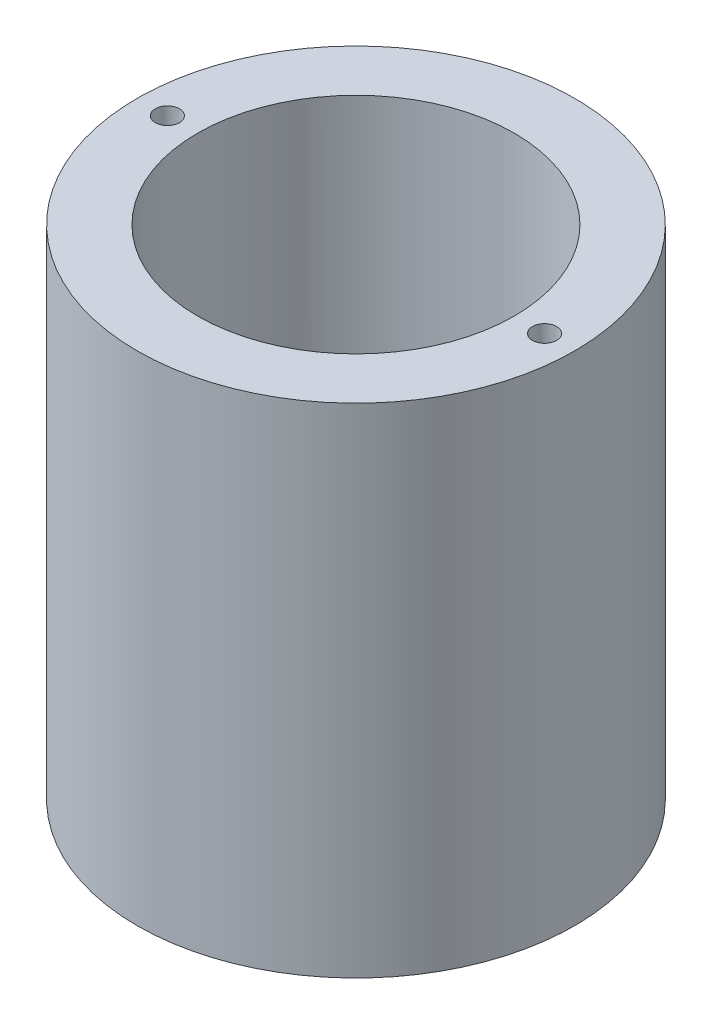
ISO-10303-21;
HEADER;
FILE_DESCRIPTION(('STEP AP214'),'2;1');
FILE_NAME('part.step','',(''),(''),'','','');
FILE_SCHEMA(('AUTOMOTIVE_DESIGN { 1 0 10303 214 1 1 1 1 }'));
ENDSEC;
DATA;
#1=APPLICATION_CONTEXT('core data for automotive mechanical design processes');
#2=APPLICATION_PROTOCOL_DEFINITION('international standard','automotive_design',2000,#1);
#3=PRODUCT_CONTEXT('',#1,'mechanical');
#4=PRODUCT('Part','Part','',(#3));
#5=PRODUCT_RELATED_PRODUCT_CATEGORY('part','',(#4));
#6=PRODUCT_DEFINITION_FORMATION('','',#4);
#7=PRODUCT_DEFINITION_CONTEXT('part definition',#1,'design');
#8=PRODUCT_DEFINITION('design','',#6,#7);
#9=PRODUCT_DEFINITION_SHAPE('','',#8);
#10=(LENGTH_UNIT() NAMED_UNIT(*) SI_UNIT(.MILLI.,.METRE.));
#11=(NAMED_UNIT(*) PLANE_ANGLE_UNIT() SI_UNIT($,.RADIAN.));
#12=(NAMED_UNIT(*) SI_UNIT($,.STERADIAN.) SOLID_ANGLE_UNIT());
#13=UNCERTAINTY_MEASURE_WITH_UNIT(LENGTH_MEASURE(1.E-05),#10,'distance_accuracy_value','');
#14=(GEOMETRIC_REPRESENTATION_CONTEXT(3) GLOBAL_UNCERTAINTY_ASSIGNED_CONTEXT((#13)) GLOBAL_UNIT_ASSIGNED_CONTEXT((#10,
#11,#12)) REPRESENTATION_CONTEXT('',''));
#15=CARTESIAN_POINT('',(0.,0.,0.));
#16=DIRECTION('',(0.,0.,1.));
#17=DIRECTION('',(1.,0.,0.));
#18=AXIS2_PLACEMENT_3D('',#15,#16,#17);
#19=CARTESIAN_POINT('',(0.,0.,0.));
#20=DIRECTION('',(0.,1.,0.));
#21=DIRECTION('',(0.,0.,1.));
#22=AXIS2_PLACEMENT_3D('',#19,#20,#21);
#23=PLANE('',#22);
#24=CARTESIAN_POINT('',(0.,0.,0.));
#25=DIRECTION('',(0.,-1.,0.));
#26=DIRECTION('',(0.,0.,-1.));
#27=AXIS2_PLACEMENT_3D('',#24,#25,#26);
#28=CIRCLE('',#27,10.5);
#29=CARTESIAN_POINT('',(0.,0.,-10.5));
#30=VERTEX_POINT('',#29);
#31=EDGE_CURVE('E48',#30,#30,#28,.T.);
#32=ORIENTED_EDGE('',*,*,#31,.F.);
#33=EDGE_LOOP('',(#32));
#34=FACE_BOUND('',#33,.T.);
#35=CARTESIAN_POINT('',(0.,0.,0.));
#36=DIRECTION('',(0.,1.,0.));
#37=DIRECTION('',(0.,0.,1.));
#38=AXIS2_PLACEMENT_3D('',#35,#36,#37);
#39=CIRCLE('',#38,14.5);
#40=CARTESIAN_POINT('',(0.,0.,14.5));
#41=VERTEX_POINT('',#40);
#42=EDGE_CURVE('E52',#41,#41,#39,.T.);
#43=ORIENTED_EDGE('',*,*,#42,.F.);
#44=EDGE_LOOP('',(#43));
#45=FACE_BOUND('',#44,.T.);
#46=ADVANCED_FACE('F37',(#34,#45),#23,.F.);
#47=CARTESIAN_POINT('',(0.,33.,0.));
#48=DIRECTION('',(0.,1.,0.));
#49=DIRECTION('',(0.,0.,1.));
#50=AXIS2_PLACEMENT_3D('',#47,#48,#49);
#51=PLANE('',#50);
#52=CARTESIAN_POINT('',(12.5,33.,0.));
#53=DIRECTION('',(0.,1.,0.));
#54=DIRECTION('',(1.,0.,0.));
#55=AXIS2_PLACEMENT_3D('',#52,#53,#54);
#56=CIRCLE('',#55,0.800000000000002);
#57=CARTESIAN_POINT('',(13.3,33.,0.));
#58=VERTEX_POINT('',#57);
#59=EDGE_CURVE('E107',#58,#58,#56,.T.);
#60=ORIENTED_EDGE('',*,*,#59,.F.);
#61=EDGE_LOOP('',(#60));
#62=FACE_BOUND('',#61,.T.);
#63=CARTESIAN_POINT('',(-12.5,33.,0.));
#64=DIRECTION('',(0.,1.,0.));
#65=DIRECTION('',(-1.,0.,0.));
#66=AXIS2_PLACEMENT_3D('',#63,#64,#65);
#67=CIRCLE('',#66,0.800000000000002);
#68=CARTESIAN_POINT('',(-13.3,33.,0.));
#69=VERTEX_POINT('',#68);
#70=EDGE_CURVE('E66',#69,#69,#67,.T.);
#71=ORIENTED_EDGE('',*,*,#70,.F.);
#72=EDGE_LOOP('',(#71));
#73=FACE_BOUND('',#72,.T.);
#74=CARTESIAN_POINT('',(0.,33.,0.));
#75=DIRECTION('',(0.,1.,0.));
#76=DIRECTION('',(0.,0.,1.));
#77=AXIS2_PLACEMENT_3D('',#74,#75,#76);
#78=CIRCLE('',#77,10.5);
#79=CARTESIAN_POINT('',(0.,33.,10.5));
#80=VERTEX_POINT('',#79);
#81=EDGE_CURVE('E10',#80,#80,#78,.T.);
#82=ORIENTED_EDGE('',*,*,#81,.F.);
#83=EDGE_LOOP('',(#82));
#84=FACE_BOUND('',#83,.T.);
#85=CARTESIAN_POINT('',(0.,33.,0.));
#86=DIRECTION('',(0.,1.,0.));
#87=DIRECTION('',(0.,0.,1.));
#88=AXIS2_PLACEMENT_3D('',#85,#86,#87);
#89=CIRCLE('',#88,14.5);
#90=CARTESIAN_POINT('',(0.,33.,14.5));
#91=VERTEX_POINT('',#90);
#92=EDGE_CURVE('E55',#91,#91,#89,.T.);
#93=ORIENTED_EDGE('',*,*,#92,.T.);
#94=EDGE_LOOP('',(#93));
#95=FACE_BOUND('',#94,.T.);
#96=ADVANCED_FACE('F85',(#62,#73,#84,#95),#51,.T.);
#97=CARTESIAN_POINT('',(0.,50.,0.));
#98=DIRECTION('',(0.,-1.,0.));
#99=DIRECTION('',(0.,0.,-1.));
#100=AXIS2_PLACEMENT_3D('',#97,#98,#99);
#101=CYLINDRICAL_SURFACE('',#100,10.5);
#102=CARTESIAN_POINT('',(-10.4694794521982,10.,-0.8));
#103=CARTESIAN_POINT('',(-10.4694798580761,9.95513367459888,-0.799998034469048));
#104=CARTESIAN_POINT('',(-10.4697709637458,9.91023647792998,-0.796212956592461));
#105=CARTESIAN_POINT('',(-10.4709039768431,9.82168338386039,-0.781168749592408));
#106=CARTESIAN_POINT('',(-10.4717465147372,9.77802896704896,-0.769901065197416));
#107=CARTESIAN_POINT('',(-10.4738864115335,9.69325685474769,-0.740218572216696));
#108=CARTESIAN_POINT('',(-10.4751835192137,9.65213777281351,-0.721807710768817));
#109=CARTESIAN_POINT('',(-10.4780860876578,9.57358371339661,-0.678368272105043));
#110=CARTESIAN_POINT('',(-10.479691480725,9.53614792981844,-0.653341147308666));
#111=CARTESIAN_POINT('',(-10.4830336476966,9.46593182147423,-0.597320751122254));
#112=CARTESIAN_POINT('',(-10.4847706678906,9.43316057152515,-0.566316119029986));
#113=CARTESIAN_POINT('',(-10.4881781032308,9.37328165674091,-0.49924469366022));
#114=CARTESIAN_POINT('',(-10.4898485155146,9.34617423509435,-0.463177683129783));
#115=CARTESIAN_POINT('',(-10.4929367962906,9.29836294825211,-0.386952045466767));
#116=CARTESIAN_POINT('',(-10.4943543582926,9.27766683239073,-0.346788544213938));
#117=CARTESIAN_POINT('',(-10.4967745795381,9.24331522174883,-0.263544082986053));
#118=CARTESIAN_POINT('',(-10.4977772449842,9.22965962171636,-0.220463166635689));
#119=CARTESIAN_POINT('',(-10.4992529836748,9.20980251599567,-0.132696270666886));
#120=CARTESIAN_POINT('',(-10.4997270902699,9.20358646398019,-0.0880135997783457));
#121=CARTESIAN_POINT('',(-10.5000957869363,9.19873995420883,0.00176323174980905));
#122=CARTESIAN_POINT('',(-10.4999903861947,9.20010937619781,0.0468573858547234));
#123=CARTESIAN_POINT('',(-10.4992127999947,9.21038300900201,0.136078534507628));
#124=CARTESIAN_POINT('',(-10.4985417912998,9.21927157615888,0.180207342071298));
#125=CARTESIAN_POINT('',(-10.4967098424459,9.24430687880874,0.266344822811022));
#126=CARTESIAN_POINT('',(-10.4955488982789,9.26045367367891,0.308353478639684));
#127=CARTESIAN_POINT('',(-10.492865698998,9.2995646237562,0.389108132123255));
#128=CARTESIAN_POINT('',(-10.491343071241,9.32253581630745,0.42785070858144));
#129=CARTESIAN_POINT('',(-10.4881077097229,9.37463838187583,0.500936096946658));
#130=CARTESIAN_POINT('',(-10.4863949727489,9.40376985900744,0.53527883447662));
#131=CARTESIAN_POINT('',(-10.4829668419238,9.4674542957484,0.59868108720224));
#132=CARTESIAN_POINT('',(-10.4812514523799,9.50202084294496,0.627726956307695));
#133=CARTESIAN_POINT('',(-10.4780157469988,9.57554675681495,0.679605620731272));
#134=CARTESIAN_POINT('',(-10.4764954312868,9.61450612630725,0.702438412062429));
#135=CARTESIAN_POINT('',(-10.473821668914,9.69572101354209,0.7412420932465));
#136=CARTESIAN_POINT('',(-10.4726682574416,9.73797684695318,0.757212324987046));
#137=CARTESIAN_POINT('',(-10.4708595206446,9.82458082725988,0.781827704256176));
#138=CARTESIAN_POINT('',(-10.4702041865856,9.86892893745091,0.79047298023522));
#139=CARTESIAN_POINT('',(-10.4694671632346,9.95833932410878,0.800175868256086));
#140=CARTESIAN_POINT('',(-10.469384036993,10.0033995266006,0.801252487135627));
#141=CARTESIAN_POINT('',(-10.4697970455325,10.0930598085143,0.795837240046155));
#142=CARTESIAN_POINT('',(-10.4702931758091,10.1376598915116,0.789345432932225));
#143=CARTESIAN_POINT('',(-10.4718074822188,10.2250796442632,0.768993436484116));
#144=CARTESIAN_POINT('',(-10.4728250329556,10.267901380618,0.755142073534505));
#145=CARTESIAN_POINT('',(-10.4752669999396,10.3506128197953,0.720473114747651));
#146=CARTESIAN_POINT('',(-10.476691421658,10.3905024831811,0.699655425233858));
#147=CARTESIAN_POINT('',(-10.4797901124594,10.4663045570531,0.651596477173982));
#148=CARTESIAN_POINT('',(-10.4814648727718,10.5022089003606,0.624342526630789));
#149=CARTESIAN_POINT('',(-10.4848738477644,10.5689397087485,0.564203079227582));
#150=CARTESIAN_POINT('',(-10.4866080633013,10.5997661006181,0.531317501188276));
#151=CARTESIAN_POINT('',(-10.4899447934114,10.6555305828148,0.4607662881091));
#152=CARTESIAN_POINT('',(-10.4915470277081,10.6804563425478,0.423090891758252));
#153=CARTESIAN_POINT('',(-10.4944352322802,10.7236274924945,0.344078310030886));
#154=CARTESIAN_POINT('',(-10.4957212052673,10.7418729399864,0.302741156054806));
#155=CARTESIAN_POINT('',(-10.497830687274,10.7711442647763,0.21762308220854));
#156=CARTESIAN_POINT('',(-10.4986546888777,10.7821778339415,0.173844820198301));
#157=CARTESIAN_POINT('',(-10.499749373413,10.7967373515924,0.0850505967035503));
#158=CARTESIAN_POINT('',(-10.5000200649295,10.8002634165621,0.0400346544334537));
#159=CARTESIAN_POINT('',(-10.4999776483617,10.7997065702557,-0.0498353701425257));
#160=CARTESIAN_POINT('',(-10.4996660169243,10.7956429049316,-0.0946895736566464));
#161=CARTESIAN_POINT('',(-10.4984969014603,10.780061999844,-0.183076610509527));
#162=CARTESIAN_POINT('',(-10.4976394165994,10.768544748688,-0.226609441828513));
#163=CARTESIAN_POINT('',(-10.4954748650823,10.7383883101633,-0.311119817315622));
#164=CARTESIAN_POINT('',(-10.4941678145334,10.7197493779517,-0.35209745297072));
#165=CARTESIAN_POINT('',(-10.4912505546679,10.6758809919843,-0.430344794426545));
#166=CARTESIAN_POINT('',(-10.4896403512893,10.6506516673105,-0.467614572831124));
#167=CARTESIAN_POINT('',(-10.4862928043459,10.5942466191329,-0.537486550664749));
#168=CARTESIAN_POINT('',(-10.4845551641373,10.5630567314297,-0.570077301477274));
#169=CARTESIAN_POINT('',(-10.481151084406,10.4956398722912,-0.629573273166098));
#170=CARTESIAN_POINT('',(-10.4794846622946,10.4594116781935,-0.656477109974676));
#171=CARTESIAN_POINT('',(-10.4764087214866,10.3828872668669,-0.70386567595816));
#172=CARTESIAN_POINT('',(-10.4749996266573,10.3425845046684,-0.724339853461894));
#173=CARTESIAN_POINT('',(-10.4726031309411,10.2591307831487,-0.758204823836393));
#174=CARTESIAN_POINT('',(-10.4716152420801,10.2159831869263,-0.771603817742966));
#175=CARTESIAN_POINT('',(-10.4704288985163,10.1438145151245,-0.787499176963897));
#176=CARTESIAN_POINT('',(-10.4700744756214,10.1152585165516,-0.792180818129912));
#177=CARTESIAN_POINT('',(-10.4695996219545,10.0578059505379,-0.798431859498126));
#178=CARTESIAN_POINT('',(-10.4694791906729,10.028909383839,-0.800001266479665));
#179=CARTESIAN_POINT('',(-10.4694794521982,10.,-0.8));
#180=B_SPLINE_CURVE_WITH_KNOTS('',3,(#102,#103,#104,#105,#106,#107,#108,#109,#110,#111,#112,
#113,#114,#115,#116,#117,#118,#119,#120,#121,#122,#123,#124,#125,#126,#127,#128,#129,#130,#131,
#132,#133,#134,#135,#136,#137,#138,#139,#140,#141,#142,#143,#144,#145,#146,#147,#148,#149,#150,
#151,#152,#153,#154,#155,#156,#157,#158,#159,#160,#161,#162,#163,#164,#165,#166,#167,#168,#169,
#170,#171,#172,#173,#174,#175,#176,#177,#178,#179),.UNSPECIFIED.,.T.,.F.,(4,2,2,2,2,2,2,2,2,2,2,
2,2,2,2,2,2,2,2,2,2,2,2,2,2,2,2,2,2,2,2,2,2,2,2,2,2,2,4),(0.,0.134493428901772,
0.269140896831049,0.403714067718712,0.538257721245932,0.673059651847963,0.807867369270437,
0.942837398455835,1.07780540985279,1.21250908890587,1.34721063246131,1.48163261537716,
1.61605569797516,1.7506178821695,1.88518234077005,2.02008871982314,2.15499518544617,
2.28991458557402,2.4248316197056,2.55940972116558,2.69398677609983,2.82840279461561,
2.9628206207031,3.09750575881159,3.23219283855498,3.36715893820558,3.50212388060187,
3.63694463951313,3.77176330657493,3.90624056606524,4.04071803109946,4.17519067849517,
4.30966069225273,4.4444543150176,4.57928070586057,4.71432721690128,4.84921684635367,
4.93587717778626,5.02253732044751),.UNSPECIFIED.);
#181=CARTESIAN_POINT('',(-10.4694794521982,10.,-0.8));
#182=VERTEX_POINT('',#181);
#183=EDGE_CURVE('E58',#182,#182,#180,.T.);
#184=ORIENTED_EDGE('',*,*,#183,.T.);
#185=EDGE_LOOP('',(#184));
#186=FACE_BOUND('',#185,.T.);
#187=ORIENTED_EDGE('',*,*,#81,.T.);
#188=EDGE_LOOP('',(#187));
#189=FACE_BOUND('',#188,.T.);
#190=ORIENTED_EDGE('',*,*,#31,.T.);
#191=EDGE_LOOP('',(#190));
#192=FACE_BOUND('',#191,.T.);
#193=ADVANCED_FACE('F68',(#186,#189,#192),#101,.F.);
#194=CARTESIAN_POINT('',(0.,0.,0.));
#195=DIRECTION('',(0.,1.,0.));
#196=DIRECTION('',(0.,0.,1.));
#197=AXIS2_PLACEMENT_3D('',#194,#195,#196);
#198=CYLINDRICAL_SURFACE('',#197,14.5);
#199=CARTESIAN_POINT('',(-14.4779142144165,10.,-0.8));
#200=CARTESIAN_POINT('',(-14.4779145106324,9.95510035479705,-0.799998020645742));
#201=CARTESIAN_POINT('',(-14.4781253274426,9.91016902374247,-0.79620734271883));
#202=CARTESIAN_POINT('',(-14.4789459448228,9.82154631266132,-0.781139590299873));
#203=CARTESIAN_POINT('',(-14.4795562132777,9.77785644948351,-0.7698537363463));
#204=CARTESIAN_POINT('',(-14.4811063976709,9.69301325903812,-0.740120149548092));
#205=CARTESIAN_POINT('',(-14.4820461432341,9.65185863368595,-0.721676117727708));
#206=CARTESIAN_POINT('',(-14.484149177247,9.57324050629224,-0.678155535394303));
#207=CARTESIAN_POINT('',(-14.4853124135245,9.53577614586623,-0.65308053232104));
#208=CARTESIAN_POINT('',(-14.4877329473318,9.46554598398927,-0.596976471855938));
#209=CARTESIAN_POINT('',(-14.4889903428882,9.43278518573277,-0.56594115526798));
#210=CARTESIAN_POINT('',(-14.4914565941191,9.37293483579917,-0.498810145758211));
#211=CARTESIAN_POINT('',(-14.4926654477939,9.34584551756055,-0.462714244644476));
#212=CARTESIAN_POINT('',(-14.4948991914958,9.2980926402246,-0.386459636736503));
#213=CARTESIAN_POINT('',(-14.4959239668863,9.27743307949802,-0.346298422397943));
#214=CARTESIAN_POINT('',(-14.4976730693174,9.24315180048868,-0.2630708438739));
#215=CARTESIAN_POINT('',(-14.4983973989959,9.22953002041308,-0.220004505199632));
#216=CARTESIAN_POINT('',(-14.4994633246719,9.20972446951457,-0.132236115590033));
#217=CARTESIAN_POINT('',(-14.4998053134092,9.20353306574548,-0.0875357919272288));
#218=CARTESIAN_POINT('',(-14.500069339744,9.19874045623244,0.00227090215592304));
#219=CARTESIAN_POINT('',(-14.4999913811994,9.2001391807619,0.0473772688423632));
#220=CARTESIAN_POINT('',(-14.4994246272165,9.21048080474284,0.136663954402979));
#221=CARTESIAN_POINT('',(-14.4989362790691,9.21941549065585,0.180845227841856));
#222=CARTESIAN_POINT('',(-14.4976042571796,9.24456267680018,0.267079910935274));
#223=CARTESIAN_POINT('',(-14.4967605817101,9.26077521241169,0.309133310244367));
#224=CARTESIAN_POINT('',(-14.4948121529549,9.30002722387635,0.389944920875952));
#225=CARTESIAN_POINT('',(-14.4937072569193,9.32307043425847,0.428701314673001));
#226=CARTESIAN_POINT('',(-14.4913607841163,9.3753269603247,0.501798904334385));
#227=CARTESIAN_POINT('',(-14.4901192061618,9.40454032959019,0.536140061852846));
#228=CARTESIAN_POINT('',(-14.4876372020864,9.46835432881981,0.599480276324294));
#229=CARTESIAN_POINT('',(-14.486396779705,9.50296208590106,0.628472153480585));
#230=CARTESIAN_POINT('',(-14.4840585888915,9.57655746246892,0.680235506070244));
#231=CARTESIAN_POINT('',(-14.482960820504,9.61554508332213,0.703006979562703));
#232=CARTESIAN_POINT('',(-14.4810318631631,9.6967978950817,0.741682544401135));
#233=CARTESIAN_POINT('',(-14.4802006851774,9.73906322074535,0.757586353217944));
#234=CARTESIAN_POINT('',(-14.4788990496953,9.82566967583145,0.782070280151442));
#235=CARTESIAN_POINT('',(-14.4784285888949,9.87001078623749,0.7906504653465));
#236=CARTESIAN_POINT('',(-14.4779020566339,9.9594475533169,0.800234679953903));
#237=CARTESIAN_POINT('',(-14.4778454397916,10.0045421384012,0.801248680451029));
#238=CARTESIAN_POINT('',(-14.4781515560354,10.0942607920328,0.795697774799667));
#239=CARTESIAN_POINT('',(-14.4785142874274,10.1388848624801,0.789132899267239));
#240=CARTESIAN_POINT('',(-14.4796177212082,10.2263676924154,0.768618869108893));
#241=CARTESIAN_POINT('',(-14.4803581894185,10.2692275278735,0.754674289340618));
#242=CARTESIAN_POINT('',(-14.4821334452413,10.351998425511,0.719801317389478));
#243=CARTESIAN_POINT('',(-14.4831682349319,10.391909466868,0.698872875897317));
#244=CARTESIAN_POINT('',(-14.4854168362603,10.4676956942913,0.650600713736195));
#245=CARTESIAN_POINT('',(-14.4866308341316,10.5035666126524,0.623250301665107));
#246=CARTESIAN_POINT('',(-14.4891003769381,10.5702113972664,0.562920337583427));
#247=CARTESIAN_POINT('',(-14.4903559221933,10.6009852242402,0.529940742197198));
#248=CARTESIAN_POINT('',(-14.4927686529571,10.6565958445873,0.459245720314626));
#249=CARTESIAN_POINT('',(-14.4939257308182,10.681426192778,0.421525219692406));
#250=CARTESIAN_POINT('',(-14.496009590214,10.7244009363219,0.342444729381002));
#251=CARTESIAN_POINT('',(-14.4969363729134,10.7425453654928,0.301084758101729));
#252=CARTESIAN_POINT('',(-14.4984546870545,10.7716219696571,0.215923251351953));
#253=CARTESIAN_POINT('',(-14.4990464093354,10.7825582507546,0.172123121361892));
#254=CARTESIAN_POINT('',(-14.4998286805019,10.7969215610459,0.0833049979108708));
#255=CARTESIAN_POINT('',(-14.5000192323019,10.8003486447919,0.0382870132997068));
#256=CARTESIAN_POINT('',(-14.4999777004686,10.7995957607704,-0.0516250272487052));
#257=CARTESIAN_POINT('',(-14.499746178002,10.7954258934959,-0.0965191683727297));
#258=CARTESIAN_POINT('',(-14.4988876598271,10.7796183790214,-0.184968912388176));
#259=CARTESIAN_POINT('',(-14.4982606633913,10.7679807180836,-0.228524512817066));
#260=CARTESIAN_POINT('',(-14.496681711895,10.7375701266762,-0.313062648998465));
#261=CARTESIAN_POINT('',(-14.4957297560402,10.7187971787678,-0.354045178462045));
#262=CARTESIAN_POINT('',(-14.493607877167,10.6746504919891,-0.432277648921233));
#263=CARTESIAN_POINT('',(-14.4924379604375,10.6492769435594,-0.469527697563436));
#264=CARTESIAN_POINT('',(-14.4900099966791,10.5926125775645,-0.539288648728261));
#265=CARTESIAN_POINT('',(-14.4887518440651,10.561314591917,-0.571793724954392));
#266=CARTESIAN_POINT('',(-14.4862899898861,10.4936969140348,-0.631098922905567));
#267=CARTESIAN_POINT('',(-14.4850863017661,10.4573759907309,-0.65789764196064));
#268=CARTESIAN_POINT('',(-14.4828681991646,10.3807099043366,-0.705044776725615));
#269=CARTESIAN_POINT('',(-14.4818539881656,10.3403604855,-0.725386274120794));
#270=CARTESIAN_POINT('',(-14.4801323462013,10.256843357206,-0.758981462737437));
#271=CARTESIAN_POINT('',(-14.4794245542391,10.2136790334254,-0.772243498697274));
#272=CARTESIAN_POINT('',(-14.4785823596601,10.141873414185,-0.787836888685162));
#273=CARTESIAN_POINT('',(-14.4783329158434,10.1136968620814,-0.792392203241512));
#274=CARTESIAN_POINT('',(-14.477998749247,10.0570177997972,-0.798474385828633));
#275=CARTESIAN_POINT('',(-14.4779140262929,10.0285152899618,-0.800001257066962));
#276=CARTESIAN_POINT('',(-14.4779142144165,10.,-0.8));
#277=B_SPLINE_CURVE_WITH_KNOTS('',3,(#199,#200,#201,#202,#203,#204,#205,#206,#207,#208,#209,
#210,#211,#212,#213,#214,#215,#216,#217,#218,#219,#220,#221,#222,#223,#224,#225,#226,#227,#228,
#229,#230,#231,#232,#233,#234,#235,#236,#237,#238,#239,#240,#241,#242,#243,#244,#245,#246,#247,
#248,#249,#250,#251,#252,#253,#254,#255,#256,#257,#258,#259,#260,#261,#262,#263,#264,#265,#266,
#267,#268,#269,#270,#271,#272,#273,#274,#275,#276),.UNSPECIFIED.,.T.,.F.,(4,2,2,2,2,2,2,2,2,2,2,
2,2,2,2,2,2,2,2,2,2,2,2,2,2,2,2,2,2,2,2,2,2,2,2,2,2,2,4),(0.,0.134594841217685,
0.269347618597129,0.404030816772941,0.538682612234211,0.673476592616594,0.808276120037484,
0.94315930636835,1.07804130838297,1.21278463226005,1.34752671832202,1.48212213678741,
1.61671820957543,1.75138800611108,1.88605897216107,2.02090939899742,2.15575986791014,
2.29061588391396,2.4254706647343,2.5601476959505,2.69482418311955,2.82941727869886,
2.96401132458783,3.09874623861968,3.23348219089746,3.36836359722097,3.50324432129909,
3.63804814434136,3.7728509880662,3.907474736036,4.04209873166009,4.17672305631033,
4.31134349721013,4.44612787111062,4.58094533798052,4.71590676553109,4.85070875741729,
4.93618860859098,5.02166836922914),.UNSPECIFIED.);
#278=CARTESIAN_POINT('',(-14.4779142144165,10.,-0.8));
#279=VERTEX_POINT('',#278);
#280=EDGE_CURVE('E40',#279,#279,#277,.T.);
#281=ORIENTED_EDGE('',*,*,#280,.F.);
#282=EDGE_LOOP('',(#281));
#283=FACE_BOUND('',#282,.T.);
#284=ORIENTED_EDGE('',*,*,#42,.T.);
#285=EDGE_LOOP('',(#284));
#286=FACE_BOUND('',#285,.T.);
#287=ORIENTED_EDGE('',*,*,#92,.F.);
#288=EDGE_LOOP('',(#287));
#289=FACE_BOUND('',#288,.T.);
#290=ADVANCED_FACE('F75',(#283,#286,#289),#198,.T.);
#291=CARTESIAN_POINT('',(-30.,10.,0.));
#292=DIRECTION('',(1.,0.,0.));
#293=DIRECTION('',(0.,0.,-1.));
#294=AXIS2_PLACEMENT_3D('',#291,#292,#293);
#295=CYLINDRICAL_SURFACE('',#294,0.8);
#296=ORIENTED_EDGE('',*,*,#280,.T.);
#297=EDGE_LOOP('',(#296));
#298=FACE_BOUND('',#297,.T.);
#299=ORIENTED_EDGE('',*,*,#183,.F.);
#300=EDGE_LOOP('',(#299));
#301=FACE_BOUND('',#300,.T.);
#302=ADVANCED_FACE('F70',(#298,#301),#295,.F.);
#303=CARTESIAN_POINT('',(-12.5,26.,0.));
#304=DIRECTION('',(0.,1.,0.));
#305=DIRECTION('',(-1.,0.,0.));
#306=AXIS2_PLACEMENT_3D('',#303,#304,#305);
#307=CYLINDRICAL_SURFACE('',#306,0.800000000000002);
#308=CARTESIAN_POINT('',(-12.5,26.,0.));
#309=DIRECTION('',(0.,1.,0.));
#310=DIRECTION('',(-1.,0.,0.));
#311=AXIS2_PLACEMENT_3D('',#308,#309,#310);
#312=CIRCLE('',#311,0.800000000000002);
#313=CARTESIAN_POINT('',(-13.3,26.,0.));
#314=VERTEX_POINT('',#313);
#315=EDGE_CURVE('E112',#314,#314,#312,.T.);
#316=ORIENTED_EDGE('',*,*,#315,.F.);
#317=EDGE_LOOP('',(#316));
#318=FACE_BOUND('',#317,.T.);
#319=ORIENTED_EDGE('',*,*,#70,.T.);
#320=EDGE_LOOP('',(#319));
#321=FACE_BOUND('',#320,.T.);
#322=ADVANCED_FACE('F74',(#318,#321),#307,.F.);
#323=CARTESIAN_POINT('',(-12.5,26.,0.));
#324=DIRECTION('',(0.,1.,0.));
#325=DIRECTION('',(-1.,0.,0.));
#326=AXIS2_PLACEMENT_3D('',#323,#324,#325);
#327=PLANE('',#326);
#328=ORIENTED_EDGE('',*,*,#315,.T.);
#329=EDGE_LOOP('',(#328));
#330=FACE_BOUND('',#329,.T.);
#331=ADVANCED_FACE('F130',(#330),#327,.T.);
#332=CARTESIAN_POINT('',(12.5,26.,0.));
#333=DIRECTION('',(0.,1.,0.));
#334=DIRECTION('',(-1.,0.,0.));
#335=AXIS2_PLACEMENT_3D('',#332,#333,#334);
#336=CYLINDRICAL_SURFACE('',#335,0.800000000000002);
#337=CARTESIAN_POINT('',(12.5,26.,0.));
#338=DIRECTION('',(0.,1.,0.));
#339=DIRECTION('',(1.,0.,0.));
#340=AXIS2_PLACEMENT_3D('',#337,#338,#339);
#341=CIRCLE('',#340,0.800000000000002);
#342=CARTESIAN_POINT('',(13.3,26.,0.));
#343=VERTEX_POINT('',#342);
#344=EDGE_CURVE('E116',#343,#343,#341,.T.);
#345=ORIENTED_EDGE('',*,*,#344,.F.);
#346=EDGE_LOOP('',(#345));
#347=FACE_BOUND('',#346,.T.);
#348=ORIENTED_EDGE('',*,*,#59,.T.);
#349=EDGE_LOOP('',(#348));
#350=FACE_BOUND('',#349,.T.);
#351=ADVANCED_FACE('F127',(#347,#350),#336,.F.);
#352=CARTESIAN_POINT('',(12.5,26.,0.));
#353=DIRECTION('',(0.,-1.,0.));
#354=DIRECTION('',(1.,0.,0.));
#355=AXIS2_PLACEMENT_3D('',#352,#353,#354);
#356=PLANE('',#355);
#357=ORIENTED_EDGE('',*,*,#344,.T.);
#358=EDGE_LOOP('',(#357));
#359=FACE_BOUND('',#358,.T.);
#360=ADVANCED_FACE('F125',(#359),#356,.F.);
#361=CLOSED_SHELL('',(#46,#96,#193,#290,#302,#322,#331,#351,#360));
#362=MANIFOLD_SOLID_BREP('B2',#361);
#363=ADVANCED_BREP_SHAPE_REPRESENTATION('',(#18,#362),#14);
#364=SHAPE_DEFINITION_REPRESENTATION(#9,#363);
ENDSEC;
END-ISO-10303-21;
